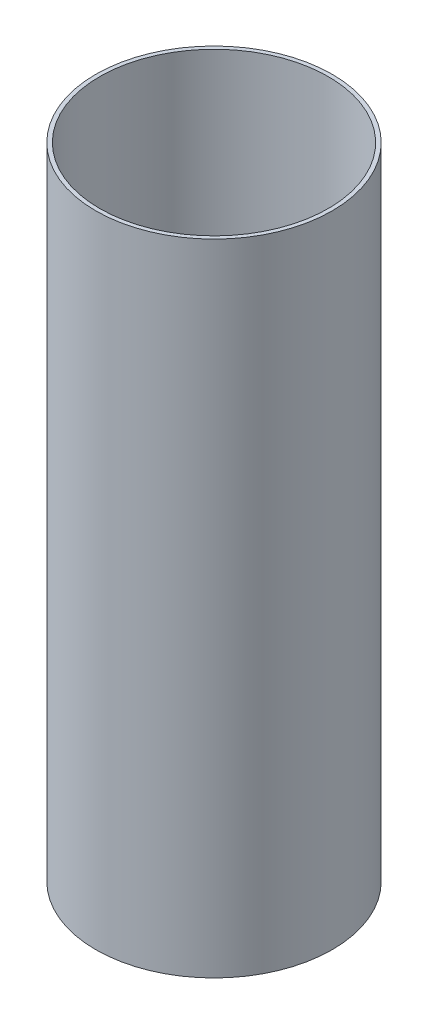
ISO-10303-21;
HEADER;
FILE_DESCRIPTION(('STEP AP214'),'2;1');
FILE_NAME('part.step','',(''),(''),'','','');
FILE_SCHEMA(('AUTOMOTIVE_DESIGN { 1 0 10303 214 1 1 1 1 }'));
ENDSEC;
DATA;
#1=APPLICATION_CONTEXT('core data for automotive mechanical design processes');
#2=APPLICATION_PROTOCOL_DEFINITION('international standard','automotive_design',2000,#1);
#3=PRODUCT_CONTEXT('',#1,'mechanical');
#4=PRODUCT('Part','Part','',(#3));
#5=PRODUCT_RELATED_PRODUCT_CATEGORY('part','',(#4));
#6=PRODUCT_DEFINITION_FORMATION('','',#4);
#7=PRODUCT_DEFINITION_CONTEXT('part definition',#1,'design');
#8=PRODUCT_DEFINITION('design','',#6,#7);
#9=PRODUCT_DEFINITION_SHAPE('','',#8);
#10=(LENGTH_UNIT() NAMED_UNIT(*) SI_UNIT(.MILLI.,.METRE.));
#11=(NAMED_UNIT(*) PLANE_ANGLE_UNIT() SI_UNIT($,.RADIAN.));
#12=(NAMED_UNIT(*) SI_UNIT($,.STERADIAN.) SOLID_ANGLE_UNIT());
#13=UNCERTAINTY_MEASURE_WITH_UNIT(LENGTH_MEASURE(1.E-05),#10,'distance_accuracy_value','');
#14=(GEOMETRIC_REPRESENTATION_CONTEXT(3) GLOBAL_UNCERTAINTY_ASSIGNED_CONTEXT((#13)) GLOBAL_UNIT_ASSIGNED_CONTEXT((#10,
#11,#12)) REPRESENTATION_CONTEXT('',''));
#15=CARTESIAN_POINT('',(0.,0.,0.));
#16=DIRECTION('',(0.,0.,1.));
#17=DIRECTION('',(1.,0.,0.));
#18=AXIS2_PLACEMENT_3D('',#15,#16,#17);
#19=CARTESIAN_POINT('',(0.,0.,0.));
#20=DIRECTION('',(0.,1.,0.));
#21=DIRECTION('',(0.,0.,1.));
#22=AXIS2_PLACEMENT_3D('',#19,#20,#21);
#23=PLANE('',#22);
#24=CARTESIAN_POINT('',(0.,0.,0.));
#25=DIRECTION('',(0.,1.,0.));
#26=DIRECTION('',(0.,0.,1.));
#27=AXIS2_PLACEMENT_3D('',#24,#25,#26);
#28=CIRCLE('',#27,4.5);
#29=CARTESIAN_POINT('',(0.,0.,4.5));
#30=VERTEX_POINT('',#29);
#31=EDGE_CURVE('E50',#30,#30,#28,.T.);
#32=ORIENTED_EDGE('',*,*,#31,.F.);
#33=EDGE_LOOP('',(#32));
#34=FACE_BOUND('',#33,.T.);
#35=CARTESIAN_POINT('',(0.,0.,0.));
#36=DIRECTION('',(0.,1.,0.));
#37=DIRECTION('',(0.,0.,1.));
#38=AXIS2_PLACEMENT_3D('',#35,#36,#37);
#39=CIRCLE('',#38,8.7);
#40=CARTESIAN_POINT('',(0.,0.,8.7));
#41=VERTEX_POINT('',#40);
#42=EDGE_CURVE('E10',#41,#41,#39,.F.);
#43=ORIENTED_EDGE('',*,*,#42,.F.);
#44=EDGE_LOOP('',(#43));
#45=FACE_BOUND('',#44,.T.);
#46=ADVANCED_FACE('F35',(#34,#45),#23,.T.);
#47=CARTESIAN_POINT('',(0.,-2.,0.));
#48=DIRECTION('',(0.,1.,0.));
#49=DIRECTION('',(0.,0.,1.));
#50=AXIS2_PLACEMENT_3D('',#47,#48,#49);
#51=CYLINDRICAL_SURFACE('',#50,9.);
#52=CARTESIAN_POINT('',(0.,-2.,0.));
#53=DIRECTION('',(0.,1.,0.));
#54=DIRECTION('',(0.,0.,1.));
#55=AXIS2_PLACEMENT_3D('',#52,#53,#54);
#56=CIRCLE('',#55,9.);
#57=CARTESIAN_POINT('',(0.,-2.,9.));
#58=VERTEX_POINT('',#57);
#59=EDGE_CURVE('E42',#58,#58,#56,.T.);
#60=ORIENTED_EDGE('',*,*,#59,.T.);
#61=EDGE_LOOP('',(#60));
#62=FACE_BOUND('',#61,.T.);
#63=CARTESIAN_POINT('',(0.,46.7,0.));
#64=DIRECTION('',(0.,1.,0.));
#65=DIRECTION('',(0.,0.,1.));
#66=AXIS2_PLACEMENT_3D('',#63,#64,#65);
#67=CIRCLE('',#66,9.);
#68=CARTESIAN_POINT('',(0.,46.7,9.));
#69=VERTEX_POINT('',#68);
#70=EDGE_CURVE('E54',#69,#69,#67,.T.);
#71=ORIENTED_EDGE('',*,*,#70,.F.);
#72=EDGE_LOOP('',(#71));
#73=FACE_BOUND('',#72,.T.);
#74=ADVANCED_FACE('F37',(#62,#73),#51,.T.);
#75=CARTESIAN_POINT('',(0.,-2.,0.));
#76=DIRECTION('',(0.,1.,0.));
#77=DIRECTION('',(0.,0.,1.));
#78=AXIS2_PLACEMENT_3D('',#75,#76,#77);
#79=PLANE('',#78);
#80=CARTESIAN_POINT('',(0.,-2.,0.));
#81=DIRECTION('',(0.,1.,0.));
#82=DIRECTION('',(0.,0.,1.));
#83=AXIS2_PLACEMENT_3D('',#80,#81,#82);
#84=CIRCLE('',#83,4.5);
#85=CARTESIAN_POINT('',(0.,-2.,4.5));
#86=VERTEX_POINT('',#85);
#87=EDGE_CURVE('E46',#86,#86,#84,.T.);
#88=ORIENTED_EDGE('',*,*,#87,.T.);
#89=EDGE_LOOP('',(#88));
#90=FACE_BOUND('',#89,.T.);
#91=ORIENTED_EDGE('',*,*,#59,.F.);
#92=EDGE_LOOP('',(#91));
#93=FACE_BOUND('',#92,.T.);
#94=ADVANCED_FACE('F74',(#90,#93),#79,.F.);
#95=CARTESIAN_POINT('',(0.,-2.,0.));
#96=DIRECTION('',(0.,1.,0.));
#97=DIRECTION('',(0.,0.,1.));
#98=AXIS2_PLACEMENT_3D('',#95,#96,#97);
#99=CYLINDRICAL_SURFACE('',#98,4.5);
#100=ORIENTED_EDGE('',*,*,#87,.F.);
#101=EDGE_LOOP('',(#100));
#102=FACE_BOUND('',#101,.T.);
#103=ORIENTED_EDGE('',*,*,#31,.T.);
#104=EDGE_LOOP('',(#103));
#105=FACE_BOUND('',#104,.T.);
#106=ADVANCED_FACE('F66',(#102,#105),#99,.F.);
#107=CARTESIAN_POINT('',(0.,46.7,0.));
#108=DIRECTION('',(0.,1.,0.));
#109=DIRECTION('',(0.,0.,1.));
#110=AXIS2_PLACEMENT_3D('',#107,#108,#109);
#111=PLANE('',#110);
#112=ORIENTED_EDGE('',*,*,#70,.T.);
#113=EDGE_LOOP('',(#112));
#114=FACE_BOUND('',#113,.T.);
#115=CARTESIAN_POINT('',(0.,46.7,0.));
#116=DIRECTION('',(0.,1.,0.));
#117=DIRECTION('',(0.,0.,1.));
#118=AXIS2_PLACEMENT_3D('',#115,#116,#117);
#119=CIRCLE('',#118,8.7);
#120=CARTESIAN_POINT('',(0.,46.7,8.7));
#121=VERTEX_POINT('',#120);
#122=EDGE_CURVE('E58',#121,#121,#119,.T.);
#123=ORIENTED_EDGE('',*,*,#122,.F.);
#124=EDGE_LOOP('',(#123));
#125=FACE_BOUND('',#124,.T.);
#126=ADVANCED_FACE('F64',(#114,#125),#111,.T.);
#127=CARTESIAN_POINT('',(0.,46.7,0.));
#128=DIRECTION('',(0.,-1.,0.));
#129=DIRECTION('',(0.,0.,-1.));
#130=AXIS2_PLACEMENT_3D('',#127,#128,#129);
#131=CYLINDRICAL_SURFACE('',#130,8.7);
#132=ORIENTED_EDGE('',*,*,#122,.T.);
#133=EDGE_LOOP('',(#132));
#134=FACE_BOUND('',#133,.T.);
#135=ORIENTED_EDGE('',*,*,#42,.T.);
#136=EDGE_LOOP('',(#135));
#137=FACE_BOUND('',#136,.T.);
#138=ADVANCED_FACE('F62',(#134,#137),#131,.F.);
#139=CLOSED_SHELL('',(#46,#74,#94,#106,#126,#138));
#140=MANIFOLD_SOLID_BREP('B2',#139);
#141=ADVANCED_BREP_SHAPE_REPRESENTATION('',(#18,#140),#14);
#142=SHAPE_DEFINITION_REPRESENTATION(#9,#141);
ENDSEC;
END-ISO-10303-21;
